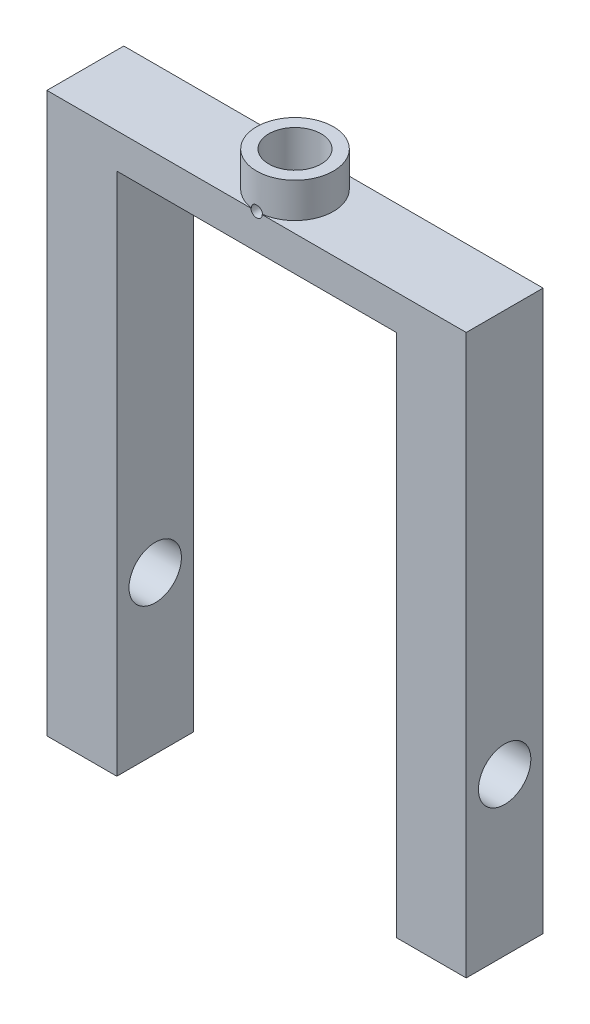
ISO-10303-21;
HEADER;
FILE_DESCRIPTION(('STEP AP214'),'2;1');
FILE_NAME('part.step','',(''),(''),'','','');
FILE_SCHEMA(('AUTOMOTIVE_DESIGN { 1 0 10303 214 1 1 1 1 }'));
ENDSEC;
DATA;
#1=APPLICATION_CONTEXT('core data for automotive mechanical design processes');
#2=APPLICATION_PROTOCOL_DEFINITION('international standard','automotive_design',2000,#1);
#3=PRODUCT_CONTEXT('',#1,'mechanical');
#4=PRODUCT('Part','Part','',(#3));
#5=PRODUCT_RELATED_PRODUCT_CATEGORY('part','',(#4));
#6=PRODUCT_DEFINITION_FORMATION('','',#4);
#7=PRODUCT_DEFINITION_CONTEXT('part definition',#1,'design');
#8=PRODUCT_DEFINITION('design','',#6,#7);
#9=PRODUCT_DEFINITION_SHAPE('','',#8);
#10=(LENGTH_UNIT() NAMED_UNIT(*) SI_UNIT(.MILLI.,.METRE.));
#11=(NAMED_UNIT(*) PLANE_ANGLE_UNIT() SI_UNIT($,.RADIAN.));
#12=(NAMED_UNIT(*) SI_UNIT($,.STERADIAN.) SOLID_ANGLE_UNIT());
#13=UNCERTAINTY_MEASURE_WITH_UNIT(LENGTH_MEASURE(1.E-05),#10,'distance_accuracy_value','');
#14=(GEOMETRIC_REPRESENTATION_CONTEXT(3) GLOBAL_UNCERTAINTY_ASSIGNED_CONTEXT((#13)) GLOBAL_UNIT_ASSIGNED_CONTEXT((#10,
#11,#12)) REPRESENTATION_CONTEXT('',''));
#15=CARTESIAN_POINT('',(0.,0.,0.));
#16=DIRECTION('',(0.,0.,1.));
#17=DIRECTION('',(1.,0.,0.));
#18=AXIS2_PLACEMENT_3D('',#15,#16,#17);
#19=CARTESIAN_POINT('',(0.,-107.95,0.));
#20=DIRECTION('',(0.,-1.,0.));
#21=DIRECTION('',(0.,0.,-1.));
#22=AXIS2_PLACEMENT_3D('',#19,#20,#21);
#23=PLANE('',#22);
#24=DIRECTION('',(0.,0.,-1.));
#25=VECTOR('',#24,1.);
#26=CARTESIAN_POINT('',(25.3999999999999,-107.95,6.98500000000001));
#27=LINE('',#26,#25);
#28=CARTESIAN_POINT('',(25.3999999999999,-107.95,6.98500000000001));
#29=VERTEX_POINT('',#28);
#30=CARTESIAN_POINT('',(25.3999999999999,-107.95,-6.985));
#31=VERTEX_POINT('',#30);
#32=EDGE_CURVE('E213',#29,#31,#27,.T.);
#33=ORIENTED_EDGE('',*,*,#32,.T.);
#34=DIRECTION('',(1.,0.,0.));
#35=VECTOR('',#34,1.);
#36=CARTESIAN_POINT('',(-38.1,-107.95,-6.98500000000001));
#37=LINE('',#36,#35);
#38=CARTESIAN_POINT('',(38.1,-107.95,-6.985));
#39=VERTEX_POINT('',#38);
#40=EDGE_CURVE('E236',#31,#39,#37,.T.);
#41=ORIENTED_EDGE('',*,*,#40,.T.);
#42=DIRECTION('',(0.,0.,1.));
#43=VECTOR('',#42,1.);
#44=CARTESIAN_POINT('',(38.1,-107.95,6.985));
#45=LINE('',#44,#43);
#46=CARTESIAN_POINT('',(38.1,-107.95,6.985));
#47=VERTEX_POINT('',#46);
#48=EDGE_CURVE('E148',#39,#47,#45,.T.);
#49=ORIENTED_EDGE('',*,*,#48,.T.);
#50=DIRECTION('',(-1.,0.,0.));
#51=VECTOR('',#50,1.);
#52=CARTESIAN_POINT('',(-38.1,-107.95,6.98499999999999));
#53=LINE('',#52,#51);
#54=EDGE_CURVE('E231',#47,#29,#53,.T.);
#55=ORIENTED_EDGE('',*,*,#54,.T.);
#56=EDGE_LOOP('',(#33,#41,#49,#55));
#57=FACE_BOUND('',#56,.T.);
#58=ADVANCED_FACE('F36',(#57),#23,.T.);
#59=CARTESIAN_POINT('',(0.,-6.35,0.));
#60=DIRECTION('',(0.,1.,0.));
#61=DIRECTION('',(0.,0.,1.));
#62=AXIS2_PLACEMENT_3D('',#59,#60,#61);
#63=CYLINDRICAL_SURFACE('',#62,6.985);
#64=CARTESIAN_POINT('',(1.016,-6.35,6.9107140730897));
#65=CARTESIAN_POINT('',(1.01599999036809,-6.32157684556948,6.91071305173377));
#66=CARTESIAN_POINT('',(1.01480651768152,-6.29316745737576,6.91088964939588));
#67=CARTESIAN_POINT('',(1.01004645072241,-6.2365549568507,6.911587352141));
#68=CARTESIAN_POINT('',(1.00648006402735,-6.2083518266945,6.91210842708984));
#69=CARTESIAN_POINT('',(0.992261159388178,-6.12442596624138,6.91416953381463));
#70=CARTESIAN_POINT('',(0.978088766424581,-6.06927013667723,6.91620753292066));
#71=CARTESIAN_POINT('',(0.940772924463184,-5.96215390341402,6.92138148427197));
#72=CARTESIAN_POINT('',(0.91762697828166,-5.91019439386286,6.92451774212002));
#73=CARTESIAN_POINT('',(0.863032429489422,-5.81088984181423,6.93153335744361));
#74=CARTESIAN_POINT('',(0.831584129691488,-5.76354463110507,6.93541268781555));
#75=CARTESIAN_POINT('',(0.761029833699582,-5.67447085503985,6.94350948822901));
#76=CARTESIAN_POINT('',(0.721874425912517,-5.63278162940318,6.94772903054114));
#77=CARTESIAN_POINT('',(0.637119146551409,-5.55653624982176,6.95601278484631));
#78=CARTESIAN_POINT('',(0.591518292513914,-5.52198118529912,6.96007697303891));
#79=CARTESIAN_POINT('',(0.494915621597855,-5.46084514450002,6.96761348032175));
#80=CARTESIAN_POINT('',(0.443890471994598,-5.43430067136693,6.97108305976884));
#81=CARTESIAN_POINT('',(0.338050219253178,-5.3901746672424,6.97701604932496));
#82=CARTESIAN_POINT('',(0.283235525603796,-5.37259216955578,6.97947956794836));
#83=CARTESIAN_POINT('',(0.171779319476236,-5.34700745317077,6.98310836075859));
#84=CARTESIAN_POINT('',(0.115153402065585,-5.33893859767276,6.984282661027));
#85=CARTESIAN_POINT('',(0.00133861272186087,-5.33240332110522,6.98523163298345));
#86=CARTESIAN_POINT('',(-0.0558502431551254,-5.33393662695137,6.98500634447563));
#87=CARTESIAN_POINT('',(-0.168710122756923,-5.346509753424,6.98318870008276));
#88=CARTESIAN_POINT('',(-0.224389352177777,-5.35747762542299,6.98160669091551));
#89=CARTESIAN_POINT('',(-0.333108209710927,-5.38849564280041,6.97726491351187));
#90=CARTESIAN_POINT('',(-0.386147788681089,-5.40854595719569,6.97450512335798));
#91=CARTESIAN_POINT('',(-0.48830175390392,-5.45723430676919,6.96810001528113));
#92=CARTESIAN_POINT('',(-0.537401344261476,-5.48590295438363,6.96445154968561));
#93=CARTESIAN_POINT('',(-0.630117999079428,-5.55099074025382,6.95667622736747));
#94=CARTESIAN_POINT('',(-0.673734942726579,-5.58741004925222,6.95254936010685));
#95=CARTESIAN_POINT('',(-0.754668797475733,-5.66736089508009,6.94423310761391));
#96=CARTESIAN_POINT('',(-0.791924587819837,-5.71095429957404,6.9400434955334));
#97=CARTESIAN_POINT('',(-0.858611905213315,-5.80382281637511,6.93210952004255));
#98=CARTESIAN_POINT('',(-0.888041153604406,-5.85309957738924,6.92836528647692));
#99=CARTESIAN_POINT('',(-0.938247106758047,-5.95600469297155,6.92174558665047));
#100=CARTESIAN_POINT('',(-0.959012692680069,-6.00963853460182,6.91887123808019));
#101=CARTESIAN_POINT('',(-0.991194358104133,-6.11964570020347,6.91433491579088));
#102=CARTESIAN_POINT('',(-1.00262446494641,-6.17601477871999,6.91267112352168));
#103=CARTESIAN_POINT('',(-1.01148555308549,-6.25233342050566,6.91137644232012));
#104=CARTESIAN_POINT('',(-1.01317923253166,-6.27184480632509,6.91112825037971));
#105=CARTESIAN_POINT('',(-1.01543495868127,-6.31090133201644,6.91079724744971));
#106=CARTESIAN_POINT('',(-1.01599890674254,-6.33044635967163,6.91071415859065));
#107=CARTESIAN_POINT('',(-1.016,-6.35,6.9107140730897));
#108=B_SPLINE_CURVE_WITH_KNOTS('',3,(#64,#65,#66,#67,#68,#69,#70,#71,#72,#73,#74,#75,#76,#77,
#78,#79,#80,#81,#82,#83,#84,#85,#86,#87,#88,#89,#90,#91,#92,#93,#94,#95,#96,#97,#98,#99,#100,
#101,#102,#103,#104,#105,#106,#107),.UNSPECIFIED.,.F.,.F.,(4,2,2,2,2,2,2,2,2,2,2,2,2,2,2,2,2,2,
2,2,2,4),(0.,0.0852166102056675,0.170425766823022,0.340498682935259,0.510618961391925,
0.680733035887453,0.851975517308368,1.02324412900306,1.19528179575802,1.36730090151628,
1.53810783058628,1.70890990194984,1.8784208576668,2.04793496797439,2.21805845562603,
2.38818569138873,2.5598653662009,2.73159497010127,2.90354429675149,3.07523477731295,
3.13396912460628,3.19260453762909),.UNSPECIFIED.);
#109=CARTESIAN_POINT('',(1.016,-6.35,6.9107140730897));
#110=VERTEX_POINT('',#109);
#111=CARTESIAN_POINT('',(-1.016,-6.35,6.9107140730897));
#112=VERTEX_POINT('',#111);
#113=EDGE_CURVE('E140',#110,#112,#108,.T.);
#114=ORIENTED_EDGE('',*,*,#113,.F.);
#115=CARTESIAN_POINT('',(0.,-6.35,0.));
#116=DIRECTION('',(0.,1.,0.));
#117=DIRECTION('',(0.,0.,1.));
#118=AXIS2_PLACEMENT_3D('',#115,#116,#117);
#119=CIRCLE('',#118,6.985);
#120=CARTESIAN_POINT('',(1.016,-6.35,-6.9107140730897));
#121=VERTEX_POINT('',#120);
#122=EDGE_CURVE('E171',#110,#121,#119,.T.);
#123=ORIENTED_EDGE('',*,*,#122,.T.);
#124=CARTESIAN_POINT('',(-1.016,-6.35,-6.9107140730897));
#125=CARTESIAN_POINT('',(-1.01599999036809,-6.32157684556948,-6.91071305173377));
#126=CARTESIAN_POINT('',(-1.01480651768152,-6.29316745737576,-6.91088964939588));
#127=CARTESIAN_POINT('',(-1.01004645072241,-6.2365549568507,-6.911587352141));
#128=CARTESIAN_POINT('',(-1.00648006402735,-6.2083518266945,-6.91210842708984));
#129=CARTESIAN_POINT('',(-0.992261159388179,-6.12442596624138,-6.91416953381463));
#130=CARTESIAN_POINT('',(-0.978088766424583,-6.06927013667723,-6.91620753292066));
#131=CARTESIAN_POINT('',(-0.940772924463186,-5.96215390341402,-6.92138148427197));
#132=CARTESIAN_POINT('',(-0.917626978281662,-5.91019439386286,-6.92451774212002));
#133=CARTESIAN_POINT('',(-0.863032429489424,-5.81088984181423,-6.93153335744361));
#134=CARTESIAN_POINT('',(-0.83158412969149,-5.76354463110507,-6.93541268781555));
#135=CARTESIAN_POINT('',(-0.761029833699584,-5.67447085503985,-6.94350948822901));
#136=CARTESIAN_POINT('',(-0.721874425912519,-5.63278162940318,-6.94772903054114));
#137=CARTESIAN_POINT('',(-0.637119146551411,-5.55653624982176,-6.95601278484631));
#138=CARTESIAN_POINT('',(-0.591518292513916,-5.52198118529912,-6.96007697303891));
#139=CARTESIAN_POINT('',(-0.494915621597856,-5.46084514450002,-6.96761348032175));
#140=CARTESIAN_POINT('',(-0.443890471994599,-5.43430067136693,-6.97108305976884));
#141=CARTESIAN_POINT('',(-0.33805021925318,-5.3901746672424,-6.97701604932496));
#142=CARTESIAN_POINT('',(-0.283235525603798,-5.37259216955578,-6.97947956794835));
#143=CARTESIAN_POINT('',(-0.171779319476238,-5.34700745317077,-6.98310836075859));
#144=CARTESIAN_POINT('',(-0.115153402065586,-5.33893859767276,-6.984282661027));
#145=CARTESIAN_POINT('',(-0.00133861272186251,-5.33240332110522,-6.98523163298345));
#146=CARTESIAN_POINT('',(0.0558502431551237,-5.33393662695137,-6.98500634447563));
#147=CARTESIAN_POINT('',(0.168710122756922,-5.346509753424,-6.98318870008276));
#148=CARTESIAN_POINT('',(0.224389352177775,-5.35747762542299,-6.98160669091551));
#149=CARTESIAN_POINT('',(0.333108209710926,-5.38849564280041,-6.97726491351187));
#150=CARTESIAN_POINT('',(0.386147788681087,-5.40854595719569,-6.97450512335798));
#151=CARTESIAN_POINT('',(0.488301753903918,-5.45723430676919,-6.96810001528113));
#152=CARTESIAN_POINT('',(0.537401344261475,-5.48590295438363,-6.96445154968561));
#153=CARTESIAN_POINT('',(0.630117999079426,-5.55099074025382,-6.95667622736747));
#154=CARTESIAN_POINT('',(0.673734942726577,-5.58741004925222,-6.95254936010685));
#155=CARTESIAN_POINT('',(0.754668797475731,-5.66736089508009,-6.94423310761391));
#156=CARTESIAN_POINT('',(0.791924587819834,-5.71095429957404,-6.9400434955334));
#157=CARTESIAN_POINT('',(0.858611905213313,-5.80382281637511,-6.93210952004255));
#158=CARTESIAN_POINT('',(0.888041153604403,-5.85309957738924,-6.92836528647692));
#159=CARTESIAN_POINT('',(0.938247106758045,-5.95600469297155,-6.92174558665048));
#160=CARTESIAN_POINT('',(0.959012692680067,-6.00963853460182,-6.9188712380802));
#161=CARTESIAN_POINT('',(0.991194358104131,-6.11964570020347,-6.91433491579088));
#162=CARTESIAN_POINT('',(1.00262446494641,-6.17601477871999,-6.91267112352168));
#163=CARTESIAN_POINT('',(1.01148555308548,-6.25233342050566,-6.91137644232012));
#164=CARTESIAN_POINT('',(1.01317923253166,-6.27184480632509,-6.91112825037971));
#165=CARTESIAN_POINT('',(1.01543495868127,-6.31090133201643,-6.91079724744971));
#166=CARTESIAN_POINT('',(1.01599890674254,-6.33044635967163,-6.91071415859065));
#167=CARTESIAN_POINT('',(1.016,-6.35,-6.9107140730897));
#168=B_SPLINE_CURVE_WITH_KNOTS('',3,(#124,#125,#126,#127,#128,#129,#130,#131,#132,#133,#134,
#135,#136,#137,#138,#139,#140,#141,#142,#143,#144,#145,#146,#147,#148,#149,#150,#151,#152,#153,
#154,#155,#156,#157,#158,#159,#160,#161,#162,#163,#164,#165,#166,#167),.UNSPECIFIED.,.F.,.F.,(4,
2,2,2,2,2,2,2,2,2,2,2,2,2,2,2,2,2,2,2,2,4),(0.,0.0852166102056675,0.170425766823022,
0.340498682935259,0.510618961391925,0.680733035887453,0.851975517308368,1.02324412900306,
1.19528179575802,1.36730090151628,1.53810783058629,1.70890990194984,1.8784208576668,
2.04793496797439,2.21805845562603,2.38818569138873,2.5598653662009,2.73159497010127,
2.90354429675149,3.07523477731295,3.13396912460628,3.19260453762909),.UNSPECIFIED.);
#169=CARTESIAN_POINT('',(-1.016,-6.35,-6.9107140730897));
#170=VERTEX_POINT('',#169);
#171=EDGE_CURVE('E60',#170,#121,#168,.T.);
#172=ORIENTED_EDGE('',*,*,#171,.F.);
#173=EDGE_CURVE('E168',#170,#112,#119,.T.);
#174=ORIENTED_EDGE('',*,*,#173,.T.);
#175=EDGE_LOOP('',(#114,#123,#172,#174));
#176=FACE_BOUND('',#175,.T.);
#177=CARTESIAN_POINT('',(0.,0.,0.));
#178=DIRECTION('',(0.,1.,0.));
#179=DIRECTION('',(0.,0.,1.));
#180=AXIS2_PLACEMENT_3D('',#177,#178,#179);
#181=CIRCLE('',#180,6.985);
#182=CARTESIAN_POINT('',(0.,0.,6.985));
#183=VERTEX_POINT('',#182);
#184=EDGE_CURVE('E167',#183,#183,#181,.T.);
#185=ORIENTED_EDGE('',*,*,#184,.F.);
#186=EDGE_LOOP('',(#185));
#187=FACE_BOUND('',#186,.T.);
#188=ADVANCED_FACE('F38',(#176,#187),#63,.T.);
#189=CARTESIAN_POINT('',(0.,0.,0.));
#190=DIRECTION('',(0.,1.,0.));
#191=DIRECTION('',(0.,0.,1.));
#192=AXIS2_PLACEMENT_3D('',#189,#190,#191);
#193=PLANE('',#192);
#194=CARTESIAN_POINT('',(0.,0.,0.));
#195=DIRECTION('',(0.,1.,0.));
#196=DIRECTION('',(0.,0.,1.));
#197=AXIS2_PLACEMENT_3D('',#194,#195,#196);
#198=CIRCLE('',#197,4.7625);
#199=CARTESIAN_POINT('',(0.,0.,4.7625));
#200=VERTEX_POINT('',#199);
#201=EDGE_CURVE('E164',#200,#200,#198,.T.);
#202=ORIENTED_EDGE('',*,*,#201,.F.);
#203=EDGE_LOOP('',(#202));
#204=FACE_BOUND('',#203,.T.);
#205=ORIENTED_EDGE('',*,*,#184,.T.);
#206=EDGE_LOOP('',(#205));
#207=FACE_BOUND('',#206,.T.);
#208=ADVANCED_FACE('F287',(#204,#207),#193,.T.);
#209=CARTESIAN_POINT('',(0.,-63.5,0.));
#210=DIRECTION('',(0.,1.,0.));
#211=DIRECTION('',(0.,0.,1.));
#212=AXIS2_PLACEMENT_3D('',#209,#210,#211);
#213=CYLINDRICAL_SURFACE('',#212,4.7625);
#214=CARTESIAN_POINT('',(0.,-7.366,4.7625));
#215=CARTESIAN_POINT('',(0.0563844626269982,-7.36599802781405,4.76249895673298));
#216=CARTESIAN_POINT('',(0.112793074959932,-7.36129043710548,4.76148846913532));
#217=CARTESIAN_POINT('',(0.224010350170093,-7.34260263850676,4.75755499453595));
#218=CARTESIAN_POINT('',(0.278817800645457,-7.32861558494378,4.75463059561945));
#219=CARTESIAN_POINT('',(0.385209148414719,-7.2918250455093,4.74719518742165));
#220=CARTESIAN_POINT('',(0.436796268547741,-7.26903054374789,4.74268579534767));
#221=CARTESIAN_POINT('',(0.53541152615669,-7.21530014417231,4.73256813284778));
#222=CARTESIAN_POINT('',(0.582439826614029,-7.18436453755606,4.72695990172791));
#223=CARTESIAN_POINT('',(0.671324662992692,-7.11472870265446,4.71516380296902));
#224=CARTESIAN_POINT('',(0.713101409348593,-7.07592778797956,4.70896903969119));
#225=CARTESIAN_POINT('',(0.789605682168651,-6.99187899558539,4.69674711588073));
#226=CARTESIAN_POINT('',(0.824332604114973,-6.9466305655616,4.69071996975937));
#227=CARTESIAN_POINT('',(0.886099813821638,-6.85038597213697,4.67944791154241));
#228=CARTESIAN_POINT('',(0.913055847892545,-6.79933460849405,4.67421184666522));
#229=CARTESIAN_POINT('',(0.957975859641681,-6.69329667376942,4.66521347578965));
#230=CARTESIAN_POINT('',(0.975940856432099,-6.63831054949117,4.66145100277374));
#231=CARTESIAN_POINT('',(1.00210651455278,-6.52682742186495,4.65589591491856));
#232=CARTESIAN_POINT('',(1.01044807248282,-6.47036493236595,4.65407490599859));
#233=CARTESIAN_POINT('',(1.01756803147105,-6.35681479196431,4.65252359691289));
#234=CARTESIAN_POINT('',(1.01634754887166,-6.29972721481605,4.65279305269102));
#235=CARTESIAN_POINT('',(1.00449161438515,-6.18758988824679,4.65536649423503));
#236=CARTESIAN_POINT('',(0.994019193338167,-6.13252197158869,4.65763524810735));
#237=CARTESIAN_POINT('',(0.964214663101185,-6.02494308617156,4.66389601929689));
#238=CARTESIAN_POINT('',(0.944882078639876,-5.97243225474526,4.6678881290566));
#239=CARTESIAN_POINT('',(0.897754543284646,-5.87099640286548,4.67718090584144));
#240=CARTESIAN_POINT('',(0.869896333842202,-5.82210170045746,4.68249129666887));
#241=CARTESIAN_POINT('',(0.80655286502954,-5.72962042209973,4.69381624331275));
#242=CARTESIAN_POINT('',(0.771066614099409,-5.68603453739187,4.69983089062834));
#243=CARTESIAN_POINT('',(0.692608449372285,-5.60446888126178,4.71203825492389));
#244=CARTESIAN_POINT('',(0.649497749592721,-5.56662265015647,4.71823209190476));
#245=CARTESIAN_POINT('',(0.557472061775643,-5.49867619230847,4.72998725753749));
#246=CARTESIAN_POINT('',(0.508556978312315,-5.46857609294029,4.7355485757876));
#247=CARTESIAN_POINT('',(0.40615240196031,-5.41694581137028,4.74542878662929));
#248=CARTESIAN_POINT('',(0.352654170437356,-5.39543246395094,4.74974523403599));
#249=CARTESIAN_POINT('',(0.242689727547825,-5.36173721833529,4.75663108108472));
#250=CARTESIAN_POINT('',(0.186223927456012,-5.34955403069916,4.75920072213205));
#251=CARTESIAN_POINT('',(0.0730732895603511,-5.33505763683325,4.76226928636029));
#252=CARTESIAN_POINT('',(0.0164128428785966,-5.3325619156994,4.76280649620917));
#253=CARTESIAN_POINT('',(-0.0965153559452815,-5.33701753981994,4.76185667827924));
#254=CARTESIAN_POINT('',(-0.152783133125559,-5.34396827709519,4.76036978077304));
#255=CARTESIAN_POINT('',(-0.262728749611462,-5.36696807301237,4.75556291925799));
#256=CARTESIAN_POINT('',(-0.316427398217918,-5.38292201831348,4.75226212732976));
#257=CARTESIAN_POINT('',(-0.420386761328547,-5.4233702707639,4.74419668083851));
#258=CARTESIAN_POINT('',(-0.470647192553415,-5.44786528061157,4.73943190583314));
#259=CARTESIAN_POINT('',(-0.567062588740859,-5.50508492238259,4.72887226744177));
#260=CARTESIAN_POINT('',(-0.613151973933937,-5.53791756683692,4.72306420231049));
#261=CARTESIAN_POINT('',(-0.699232510619355,-5.61073754407921,4.71109034202162));
#262=CARTESIAN_POINT('',(-0.739222910204588,-5.6507257577155,4.70492450288537));
#263=CARTESIAN_POINT('',(-0.812686827514903,-5.73755738416359,4.69279871582542));
#264=CARTESIAN_POINT('',(-0.846034271432798,-5.78450836581414,4.6868442476404));
#265=CARTESIAN_POINT('',(-0.904370869089752,-5.8834519818099,4.67593882398893));
#266=CARTESIAN_POINT('',(-0.929360377887901,-5.93544440186529,4.67098782589691));
#267=CARTESIAN_POINT('',(-0.970107325899271,-6.04272005516094,4.66269566041667));
#268=CARTESIAN_POINT('',(-0.985915651792797,-6.09798324201427,4.65934563831651));
#269=CARTESIAN_POINT('',(-1.00800226948227,-6.21046175093359,4.65461787533928));
#270=CARTESIAN_POINT('',(-1.0142820003555,-6.2676767768839,4.65323983664081));
#271=CARTESIAN_POINT('',(-1.01707426037763,-6.38116532837086,4.65263018010158));
#272=CARTESIAN_POINT('',(-1.01378647180097,-6.43743379805319,4.65335467962954));
#273=CARTESIAN_POINT('',(-0.997981735336247,-6.5485953626206,4.65676957783197));
#274=CARTESIAN_POINT('',(-0.985464885429202,-6.60348847210089,4.65945995563555));
#275=CARTESIAN_POINT('',(-0.951651657537014,-6.71019184033586,4.6664825982999));
#276=CARTESIAN_POINT('',(-0.930382987590452,-6.76201124324431,4.6708096779428));
#277=CARTESIAN_POINT('',(-0.879694180993217,-6.86137634814395,4.68062046117072));
#278=CARTESIAN_POINT('',(-0.850273243242921,-6.90892162952122,4.68610427841231));
#279=CARTESIAN_POINT('',(-0.783446902673266,-6.99937619518043,4.69774268223457));
#280=CARTESIAN_POINT('',(-0.745898620808694,-7.0421785421409,4.70390815442029));
#281=CARTESIAN_POINT('',(-0.664174661027307,-7.12094050291085,4.71614058952408));
#282=CARTESIAN_POINT('',(-0.619997456785978,-7.15689853646467,4.72220752939737));
#283=CARTESIAN_POINT('',(-0.525620103169967,-7.22136988505508,4.73364704227093));
#284=CARTESIAN_POINT('',(-0.475353001223227,-7.24978694178084,4.73901023281778));
#285=CARTESIAN_POINT('',(-0.370653335418521,-7.29772416408342,4.74834441943046));
#286=CARTESIAN_POINT('',(-0.316224390091353,-7.31725195800496,4.75231660850988));
#287=CARTESIAN_POINT('',(-0.218100124570982,-7.34328589945028,4.75769368190114));
#288=CARTESIAN_POINT('',(-0.174944300637535,-7.35178775680359,4.75948507228609));
#289=CARTESIAN_POINT('',(-0.0878638522627293,-7.36314546163905,4.7618886140483));
#290=CARTESIAN_POINT('',(-0.0439392589073079,-7.36600153688419,4.76250081299666));
#291=CARTESIAN_POINT('',(0.,-7.366,4.7625));
#292=B_SPLINE_CURVE_WITH_KNOTS('',3,(#214,#215,#216,#217,#218,#219,#220,#221,#222,#223,#224,
#225,#226,#227,#228,#229,#230,#231,#232,#233,#234,#235,#236,#237,#238,#239,#240,#241,#242,#243,
#244,#245,#246,#247,#248,#249,#250,#251,#252,#253,#254,#255,#256,#257,#258,#259,#260,#261,#262,
#263,#264,#265,#266,#267,#268,#269,#270,#271,#272,#273,#274,#275,#276,#277,#278,#279,#280,#281,
#282,#283,#284,#285,#286,#287,#288,#289,#290,#291),.UNSPECIFIED.,.T.,.F.,(4,2,2,2,2,2,2,2,2,2,2,
2,2,2,2,2,2,2,2,2,2,2,2,2,2,2,2,2,2,2,2,2,2,2,2,2,2,2,4),(0.,0.168992580387775,
0.338109969319218,0.50705530216121,0.675994592844599,0.847251218816112,1.0185225237342,
1.19158638441572,1.36463062428471,1.53510782090322,1.70556511506571,1.87307734451114,
2.04059856059405,2.20939419332268,2.37821178087482,2.55049693260358,2.72278491714456,
2.89540904151401,3.06800930470525,3.2373414755477,3.40666274859645,3.57422786165849,
3.74180676404641,3.91167848623336,4.08157113397952,4.25443220932223,4.42728594030375,
4.59917225493719,4.77103260747243,4.93933197990242,5.10762956559519,5.27539837560668,
5.44318367762093,5.61420081535429,5.78525739076936,5.95840251613624,6.1313987751364,
6.26309655094658,6.39478901367686),.UNSPECIFIED.);
#293=CARTESIAN_POINT('',(0.,-7.366,4.7625));
#294=VERTEX_POINT('',#293);
#295=EDGE_CURVE('E187',#294,#294,#292,.T.);
#296=ORIENTED_EDGE('',*,*,#295,.T.);
#297=EDGE_LOOP('',(#296));
#298=FACE_BOUND('',#297,.T.);
#299=CARTESIAN_POINT('',(1.016,-6.35,-4.65286473583748));
#300=CARTESIAN_POINT('',(1.01599801576459,-6.40636800388528,-4.65286587355159));
#301=CARTESIAN_POINT('',(1.01129307972245,-6.46276018802121,-4.65390020873217));
#302=CARTESIAN_POINT('',(0.992616780304668,-6.5739433591813,-4.65791864150835));
#303=CARTESIAN_POINT('',(0.978638505946927,-6.62873312017533,-4.66090419322901));
#304=CARTESIAN_POINT('',(0.941873629948344,-6.73508699124913,-4.66847189208986));
#305=CARTESIAN_POINT('',(0.919096424076567,-6.78665447416762,-4.67305233564265));
#306=CARTESIAN_POINT('',(0.865406803845662,-6.8852365842744,-4.68329167418235));
#307=CARTESIAN_POINT('',(0.83449464141561,-6.93225135239269,-4.68895053577054));
#308=CARTESIAN_POINT('',(0.764882917069571,-7.02115044786888,-4.70081072765601));
#309=CARTESIAN_POINT('',(0.726077399805326,-7.06295093463981,-4.70701870855264));
#310=CARTESIAN_POINT('',(0.642009303727054,-7.13950131806705,-4.71921934129388));
#311=CARTESIAN_POINT('',(0.596746238450536,-7.17425068306739,-4.72521197687341));
#312=CARTESIAN_POINT('',(0.500487812751033,-7.23604219991926,-4.73637893556834));
#313=CARTESIAN_POINT('',(0.449439766159013,-7.26300399694379,-4.74154449775951));
#314=CARTESIAN_POINT('',(0.343408992865176,-7.30793556528545,-4.75040028963118));
#315=CARTESIAN_POINT('',(0.288426686558098,-7.3259062957065,-4.75409067666458));
#316=CARTESIAN_POINT('',(0.176959423376635,-7.3520827111015,-4.75953331786731));
#317=CARTESIAN_POINT('',(0.120509163264129,-7.36043020111512,-4.76131368945404));
#318=CARTESIAN_POINT('',(0.00698327740264601,-7.36756626774982,-4.76283302707285));
#319=CARTESIAN_POINT('',(-0.0500922794704674,-7.36635588679763,-4.76257221572606));
#320=CARTESIAN_POINT('',(-0.162271965507565,-7.35451675926192,-4.7600601512617));
#321=CARTESIAN_POINT('',(-0.21739305188001,-7.34404082987405,-4.75784119526682));
#322=CARTESIAN_POINT('',(-0.325076427690872,-7.31421116202494,-4.75169884956543));
#323=CARTESIAN_POINT('',(-0.37763860509791,-7.29485703525402,-4.74777538530848));
#324=CARTESIAN_POINT('',(-0.479139810629405,-7.24768330478238,-4.7386125422121));
#325=CARTESIAN_POINT('',(-0.528050799680563,-7.21980520038412,-4.7333641148739));
#326=CARTESIAN_POINT('',(-0.620556385989135,-7.15641839247413,-4.72212775676388));
#327=CARTESIAN_POINT('',(-0.664150290930595,-7.12090869694292,-4.71613972989566));
#328=CARTESIAN_POINT('',(-0.745692556840185,-7.0424328078781,-4.70394354557891));
#329=CARTESIAN_POINT('',(-0.783512004187263,-6.99933286301451,-4.69773337718631));
#330=CARTESIAN_POINT('',(-0.851409398130921,-6.90733859527155,-4.68590435079411));
#331=CARTESIAN_POINT('',(-0.881487155009428,-6.85844413043438,-4.68028550728752));
#332=CARTESIAN_POINT('',(-0.933100814054983,-6.75604727086455,-4.67027038667192));
#333=CARTESIAN_POINT('',(-0.95461339460441,-6.70253277152883,-4.66587745711669));
#334=CARTESIAN_POINT('',(-0.988302228565442,-6.59253267158315,-4.65885867259004));
#335=CARTESIAN_POINT('',(-1.00047988358828,-6.53604751836952,-4.65623255234473));
#336=CARTESIAN_POINT('',(-1.01495540045912,-6.42288462690075,-4.65309855219236));
#337=CARTESIAN_POINT('',(-1.01744051117202,-6.36623192514545,-4.65255053162509));
#338=CARTESIAN_POINT('',(-1.01296643735987,-6.25332167404468,-4.65352665668286));
#339=CARTESIAN_POINT('',(-1.00600786765198,-6.19706409921473,-4.65505066741132));
#340=CARTESIAN_POINT('',(-0.983006122743022,-6.08718630643802,-4.65996132495301));
#341=CARTESIAN_POINT('',(-0.967065162986005,-6.03354366751809,-4.66332700220772));
#342=CARTESIAN_POINT('',(-0.926661406207641,-5.92969064295339,-4.6715230064747));
#343=CARTESIAN_POINT('',(-0.902197826525817,-5.87948057303956,-4.6763534679977));
#344=CARTESIAN_POINT('',(-0.845027372661013,-5.78310496089212,-4.68702355052558));
#345=CARTESIAN_POINT('',(-0.812204610327412,-5.73700972168332,-4.69287696213641));
#346=CARTESIAN_POINT('',(-0.739399983920291,-5.65091284795116,-4.70489661374079));
#347=CARTESIAN_POINT('',(-0.699417276194534,-5.61091193254755,-4.71106289053763));
#348=CARTESIAN_POINT('',(-0.612582372440938,-5.53741739025315,-4.72314520438194));
#349=CARTESIAN_POINT('',(-0.565621360424497,-5.50405111451318,-4.72905490161764));
#350=CARTESIAN_POINT('',(-0.466651893822959,-5.4456814977383,-4.7398434994514));
#351=CARTESIAN_POINT('',(-0.414643668672484,-5.42067777679055,-4.74472244687296));
#352=CARTESIAN_POINT('',(-0.307371690627028,-5.37992285610098,-4.75287298394571));
#353=CARTESIAN_POINT('',(-0.252130347809045,-5.36411473281318,-4.75615444145243));
#354=CARTESIAN_POINT('',(-0.139698545848657,-5.34202114985736,-4.76078283475008));
#355=CARTESIAN_POINT('',(-0.0825083566509156,-5.33573437677664,-4.76213003735845));
#356=CARTESIAN_POINT('',(0.0309865827629287,-5.33291858976441,-4.76273068322822));
#357=CARTESIAN_POINT('',(0.0872864749104617,-5.3361990513461,-4.76202500874447));
#358=CARTESIAN_POINT('',(0.198512857553866,-5.35200007839691,-4.75868629565213));
#359=CARTESIAN_POINT('',(0.253439370421762,-5.36452049324787,-4.75605328846052));
#360=CARTESIAN_POINT('',(0.360220928577693,-5.39835662455508,-4.74915823186809));
#361=CARTESIAN_POINT('',(0.412084479675824,-5.41964653440411,-4.74490096497895));
#362=CARTESIAN_POINT('',(0.511529232397216,-5.47039166737612,-4.73521310143927));
#363=CARTESIAN_POINT('',(0.559110039980568,-5.49984764081421,-4.72978239698093));
#364=CARTESIAN_POINT('',(0.64957185032592,-5.56671637618174,-4.71821812480735));
#365=CARTESIAN_POINT('',(0.692351902892584,-5.6042638230861,-4.71207359112307));
#366=CARTESIAN_POINT('',(0.771069274587618,-5.68597646069449,-4.69983500698915));
#367=CARTESIAN_POINT('',(0.807004951719804,-5.7301432348749,-4.69374096898822));
#368=CARTESIAN_POINT('',(0.871447372813972,-5.82450864653248,-4.68220821171785));
#369=CARTESIAN_POINT('',(0.899854967305772,-5.87477617897798,-4.67677870140351));
#370=CARTESIAN_POINT('',(0.947774386136033,-5.97947576138743,-4.6673044952787));
#371=CARTESIAN_POINT('',(0.967293901331951,-6.03390416313176,-4.6632586029809));
#372=CARTESIAN_POINT('',(0.993308451476765,-6.13200744104041,-4.65777558865696));
#373=CARTESIAN_POINT('',(1.0018017938676,-6.17514162291809,-4.65594599724294));
#374=CARTESIAN_POINT('',(1.01314821661666,-6.26217899976878,-4.65349015418274));
#375=CARTESIAN_POINT('',(1.01600154597157,-6.30608216070638,-4.6528638494136));
#376=CARTESIAN_POINT('',(1.016,-6.35,-4.65286473583748));
#377=B_SPLINE_CURVE_WITH_KNOTS('',3,(#299,#300,#301,#302,#303,#304,#305,#306,#307,#308,#309,
#310,#311,#312,#313,#314,#315,#316,#317,#318,#319,#320,#321,#322,#323,#324,#325,#326,#327,#328,
#329,#330,#331,#332,#333,#334,#335,#336,#337,#338,#339,#340,#341,#342,#343,#344,#345,#346,#347,
#348,#349,#350,#351,#352,#353,#354,#355,#356,#357,#358,#359,#360,#361,#362,#363,#364,#365,#366,
#367,#368,#369,#370,#371,#372,#373,#374,#375,#376),.UNSPECIFIED.,.T.,.F.,(4,2,2,2,2,2,2,2,2,2,2,
2,2,2,2,2,2,2,2,2,2,2,2,2,2,2,2,2,2,2,2,2,2,2,2,2,2,2,4),(0.,0.168943102373727,
0.338012251731803,0.506901360695408,0.675785239997251,0.847106600001079,1.01844087287296,
1.19148456800221,1.36450980010617,1.53495141535316,1.70537444168626,1.8730380201716,
2.04070893253287,2.2095574437046,2.37842791653915,2.55064297068741,2.72286224474066,
2.89554728924748,3.0682064005284,3.23751291387655,3.40680840529761,3.57421520787043,
3.74163738801987,3.91152063096912,4.08142390434978,4.25432674977969,4.42722173912492,
4.59903474238004,4.77082404291084,4.93921579006353,5.10760479236505,5.27550176512364,
5.44341416972544,5.61437351952117,5.78537383170837,5.9585254599757,6.13152697403303,
6.26316093467031,6.39478908376915),.UNSPECIFIED.);
#378=CARTESIAN_POINT('',(1.016,-6.35,-4.65286473583748));
#379=VERTEX_POINT('',#378);
#380=EDGE_CURVE('E192',#379,#379,#377,.T.);
#381=ORIENTED_EDGE('',*,*,#380,.T.);
#382=EDGE_LOOP('',(#381));
#383=FACE_BOUND('',#382,.T.);
#384=ORIENTED_EDGE('',*,*,#201,.T.);
#385=EDGE_LOOP('',(#384));
#386=FACE_BOUND('',#385,.T.);
#387=CARTESIAN_POINT('',(0.,-12.7,0.));
#388=DIRECTION('',(0.,1.,0.));
#389=DIRECTION('',(-1.,0.,0.));
#390=AXIS2_PLACEMENT_3D('',#387,#388,#389);
#391=CIRCLE('',#390,4.7625);
#392=CARTESIAN_POINT('',(-4.7625,-12.7,0.));
#393=VERTEX_POINT('',#392);
#394=EDGE_CURVE('E174',#393,#393,#391,.T.);
#395=ORIENTED_EDGE('',*,*,#394,.F.);
#396=EDGE_LOOP('',(#395));
#397=FACE_BOUND('',#396,.T.);
#398=ADVANCED_FACE('F283',(#298,#383,#386,#397),#213,.F.);
#399=CARTESIAN_POINT('',(0.,-6.35,0.));
#400=DIRECTION('',(0.,-1.,0.));
#401=DIRECTION('',(0.,0.,-1.));
#402=AXIS2_PLACEMENT_3D('',#399,#400,#401);
#403=PLANE('',#402);
#404=DIRECTION('',(-1.,0.,0.));
#405=VECTOR('',#404,1.);
#406=CARTESIAN_POINT('',(-38.1,-6.35,6.98499999999999));
#407=LINE('',#406,#405);
#408=CARTESIAN_POINT('',(-1.016,-6.35,6.985));
#409=VERTEX_POINT('',#408);
#410=CARTESIAN_POINT('',(-38.1,-6.35,6.98499999999999));
#411=VERTEX_POINT('',#410);
#412=EDGE_CURVE('E239',#409,#411,#407,.T.);
#413=ORIENTED_EDGE('',*,*,#412,.F.);
#414=DIRECTION('',(0.,0.,1.));
#415=VECTOR('',#414,1.);
#416=CARTESIAN_POINT('',(-1.016,-6.35,-9.85868195874213));
#417=LINE('',#416,#415);
#418=EDGE_CURVE('E257',#409,#112,#417,.F.);
#419=ORIENTED_EDGE('',*,*,#418,.T.);
#420=ORIENTED_EDGE('',*,*,#173,.F.);
#421=CARTESIAN_POINT('',(-1.016,-6.35,-6.985));
#422=VERTEX_POINT('',#421);
#423=EDGE_CURVE('E255',#170,#422,#417,.F.);
#424=ORIENTED_EDGE('',*,*,#423,.T.);
#425=DIRECTION('',(1.,0.,0.));
#426=VECTOR('',#425,1.);
#427=CARTESIAN_POINT('',(-38.1,-6.35,-6.98500000000001));
#428=LINE('',#427,#426);
#429=CARTESIAN_POINT('',(-38.1,-6.35,-6.98500000000001));
#430=VERTEX_POINT('',#429);
#431=EDGE_CURVE('E139',#430,#422,#428,.T.);
#432=ORIENTED_EDGE('',*,*,#431,.F.);
#433=DIRECTION('',(0.,0.,-1.));
#434=VECTOR('',#433,1.);
#435=CARTESIAN_POINT('',(-38.1,-6.35,6.98499999999999));
#436=LINE('',#435,#434);
#437=EDGE_CURVE('E146',#411,#430,#436,.T.);
#438=ORIENTED_EDGE('',*,*,#437,.F.);
#439=EDGE_LOOP('',(#413,#419,#420,#424,#432,#438));
#440=FACE_BOUND('',#439,.T.);
#441=ADVANCED_FACE('F253',(#440),#403,.F.);
#442=DIRECTION('',(0.,0.,-1.));
#443=VECTOR('',#442,1.);
#444=CARTESIAN_POINT('',(-25.4000000000001,-107.95,6.98500000000001));
#445=LINE('',#444,#443);
#446=CARTESIAN_POINT('',(-25.4000000000001,-107.95,6.98500000000001));
#447=VERTEX_POINT('',#446);
#448=CARTESIAN_POINT('',(-25.4000000000001,-107.95,-6.985));
#449=VERTEX_POINT('',#448);
#450=EDGE_CURVE('E224',#447,#449,#445,.T.);
#451=ORIENTED_EDGE('',*,*,#450,.F.);
#452=CARTESIAN_POINT('',(-38.1,-107.95,6.98499999999999));
#453=VERTEX_POINT('',#452);
#454=EDGE_CURVE('E230',#447,#453,#53,.T.);
#455=ORIENTED_EDGE('',*,*,#454,.T.);
#456=DIRECTION('',(0.,0.,-1.));
#457=VECTOR('',#456,1.);
#458=CARTESIAN_POINT('',(-38.1,-107.95,6.98499999999999));
#459=LINE('',#458,#457);
#460=CARTESIAN_POINT('',(-38.1,-107.95,-6.98500000000001));
#461=VERTEX_POINT('',#460);
#462=EDGE_CURVE('E234',#453,#461,#459,.T.);
#463=ORIENTED_EDGE('',*,*,#462,.T.);
#464=EDGE_CURVE('E156',#461,#449,#37,.T.);
#465=ORIENTED_EDGE('',*,*,#464,.T.);
#466=EDGE_LOOP('',(#451,#455,#463,#465));
#467=FACE_BOUND('',#466,.T.);
#468=ADVANCED_FACE('F303',(#467),#23,.T.);
#469=CARTESIAN_POINT('',(-38.1,-107.95,-6.98500000000001));
#470=DIRECTION('',(0.,0.,1.));
#471=DIRECTION('',(1.,0.,0.));
#472=AXIS2_PLACEMENT_3D('',#469,#470,#471);
#473=PLANE('',#472);
#474=ORIENTED_EDGE('',*,*,#431,.T.);
#475=CARTESIAN_POINT('',(0.,-6.35,-6.985));
#476=DIRECTION('',(0.,0.,1.));
#477=DIRECTION('',(1.,0.,0.));
#478=AXIS2_PLACEMENT_3D('',#475,#476,#477);
#479=CIRCLE('',#478,1.016);
#480=CARTESIAN_POINT('',(1.016,-6.35,-6.985));
#481=VERTEX_POINT('',#480);
#482=EDGE_CURVE('E125',#481,#422,#479,.F.);
#483=ORIENTED_EDGE('',*,*,#482,.F.);
#484=CARTESIAN_POINT('',(38.1,-6.35,-6.985));
#485=VERTEX_POINT('',#484);
#486=EDGE_CURVE('E135',#481,#485,#428,.T.);
#487=ORIENTED_EDGE('',*,*,#486,.T.);
#488=DIRECTION('',(0.,1.,0.));
#489=VECTOR('',#488,1.);
#490=CARTESIAN_POINT('',(38.1,-107.95,-6.985));
#491=LINE('',#490,#489);
#492=EDGE_CURVE('E153',#39,#485,#491,.T.);
#493=ORIENTED_EDGE('',*,*,#492,.F.);
#494=ORIENTED_EDGE('',*,*,#40,.F.);
#495=DIRECTION('',(0.,-1.,0.));
#496=VECTOR('',#495,1.);
#497=CARTESIAN_POINT('',(25.3999999999999,-12.7,-6.985));
#498=LINE('',#497,#496);
#499=CARTESIAN_POINT('',(25.3999999999999,-12.7,-6.985));
#500=VERTEX_POINT('',#499);
#501=EDGE_CURVE('E176',#500,#31,#498,.T.);
#502=ORIENTED_EDGE('',*,*,#501,.F.);
#503=DIRECTION('',(1.,0.,0.));
#504=VECTOR('',#503,1.);
#505=CARTESIAN_POINT('',(-25.4000000000001,-12.7,-6.985));
#506=LINE('',#505,#504);
#507=CARTESIAN_POINT('',(-25.4000000000001,-12.7,-6.985));
#508=VERTEX_POINT('',#507);
#509=EDGE_CURVE('E207',#508,#500,#506,.T.);
#510=ORIENTED_EDGE('',*,*,#509,.F.);
#511=DIRECTION('',(0.,1.,0.));
#512=VECTOR('',#511,1.);
#513=CARTESIAN_POINT('',(-25.4000000000001,-12.7,-6.985));
#514=LINE('',#513,#512);
#515=EDGE_CURVE('E215',#449,#508,#514,.T.);
#516=ORIENTED_EDGE('',*,*,#515,.F.);
#517=ORIENTED_EDGE('',*,*,#464,.F.);
#518=DIRECTION('',(0.,1.,0.));
#519=VECTOR('',#518,1.);
#520=CARTESIAN_POINT('',(-38.1,-107.95,-6.98500000000001));
#521=LINE('',#520,#519);
#522=EDGE_CURVE('E155',#461,#430,#521,.T.);
#523=ORIENTED_EDGE('',*,*,#522,.T.);
#524=EDGE_LOOP('',(#474,#483,#487,#493,#494,#502,#510,#516,#517,#523));
#525=FACE_BOUND('',#524,.T.);
#526=ADVANCED_FACE('F133',(#525),#473,.F.);
#527=CARTESIAN_POINT('',(-38.1,-107.95,6.98499999999999));
#528=DIRECTION('',(1.,0.,0.));
#529=DIRECTION('',(0.,0.,-1.));
#530=AXIS2_PLACEMENT_3D('',#527,#528,#529);
#531=PLANE('',#530);
#532=CARTESIAN_POINT('',(-38.1,-79.375,0.));
#533=DIRECTION('',(-1.,0.,0.));
#534=DIRECTION('',(0.,0.,1.));
#535=AXIS2_PLACEMENT_3D('',#532,#533,#534);
#536=CIRCLE('',#535,4.76249999999999);
#537=CARTESIAN_POINT('',(-38.1,-79.375,4.76249999999999));
#538=VERTEX_POINT('',#537);
#539=EDGE_CURVE('E181',#538,#538,#536,.T.);
#540=ORIENTED_EDGE('',*,*,#539,.F.);
#541=EDGE_LOOP('',(#540));
#542=FACE_BOUND('',#541,.T.);
#543=ORIENTED_EDGE('',*,*,#437,.T.);
#544=ORIENTED_EDGE('',*,*,#522,.F.);
#545=ORIENTED_EDGE('',*,*,#462,.F.);
#546=DIRECTION('',(0.,1.,0.));
#547=VECTOR('',#546,1.);
#548=CARTESIAN_POINT('',(-38.1,-107.95,6.98499999999999));
#549=LINE('',#548,#547);
#550=EDGE_CURVE('E158',#453,#411,#549,.T.);
#551=ORIENTED_EDGE('',*,*,#550,.T.);
#552=EDGE_LOOP('',(#543,#544,#545,#551));
#553=FACE_BOUND('',#552,.T.);
#554=ADVANCED_FACE('F251',(#542,#553),#531,.F.);
#555=CARTESIAN_POINT('',(-38.1,-107.95,6.98499999999999));
#556=DIRECTION('',(0.,0.,-1.));
#557=DIRECTION('',(-1.,0.,0.));
#558=AXIS2_PLACEMENT_3D('',#555,#556,#557);
#559=PLANE('',#558);
#560=CARTESIAN_POINT('',(38.1,-6.35,6.985));
#561=VERTEX_POINT('',#560);
#562=CARTESIAN_POINT('',(1.01599999999998,-6.35,6.985));
#563=VERTEX_POINT('',#562);
#564=EDGE_CURVE('E149',#561,#563,#407,.T.);
#565=ORIENTED_EDGE('',*,*,#564,.T.);
#566=CARTESIAN_POINT('',(0.,-6.35,6.985));
#567=DIRECTION('',(0.,0.,1.));
#568=DIRECTION('',(1.,0.,0.));
#569=AXIS2_PLACEMENT_3D('',#566,#567,#568);
#570=CIRCLE('',#569,1.016);
#571=EDGE_CURVE('E52',#409,#563,#570,.T.);
#572=ORIENTED_EDGE('',*,*,#571,.F.);
#573=ORIENTED_EDGE('',*,*,#412,.T.);
#574=ORIENTED_EDGE('',*,*,#550,.F.);
#575=ORIENTED_EDGE('',*,*,#454,.F.);
#576=DIRECTION('',(0.,1.,0.));
#577=VECTOR('',#576,1.);
#578=CARTESIAN_POINT('',(-25.4000000000001,-12.7,6.98500000000001));
#579=LINE('',#578,#577);
#580=CARTESIAN_POINT('',(-25.4000000000001,-12.7,6.985));
#581=VERTEX_POINT('',#580);
#582=EDGE_CURVE('E206',#447,#581,#579,.T.);
#583=ORIENTED_EDGE('',*,*,#582,.T.);
#584=DIRECTION('',(1.,0.,0.));
#585=VECTOR('',#584,1.);
#586=CARTESIAN_POINT('',(-25.4000000000001,-12.7,6.98500000000001));
#587=LINE('',#586,#585);
#588=CARTESIAN_POINT('',(25.3999999999999,-12.7,6.98500000000001));
#589=VERTEX_POINT('',#588);
#590=EDGE_CURVE('E210',#581,#589,#587,.T.);
#591=ORIENTED_EDGE('',*,*,#590,.T.);
#592=DIRECTION('',(0.,-1.,0.));
#593=VECTOR('',#592,1.);
#594=CARTESIAN_POINT('',(25.3999999999999,-12.7,6.98500000000001));
#595=LINE('',#594,#593);
#596=EDGE_CURVE('E203',#589,#29,#595,.T.);
#597=ORIENTED_EDGE('',*,*,#596,.T.);
#598=ORIENTED_EDGE('',*,*,#54,.F.);
#599=DIRECTION('',(0.,1.,0.));
#600=VECTOR('',#599,1.);
#601=CARTESIAN_POINT('',(38.1,-107.95,6.985));
#602=LINE('',#601,#600);
#603=EDGE_CURVE('E161',#47,#561,#602,.T.);
#604=ORIENTED_EDGE('',*,*,#603,.T.);
#605=EDGE_LOOP('',(#565,#572,#573,#574,#575,#583,#591,#597,#598,#604));
#606=FACE_BOUND('',#605,.T.);
#607=ADVANCED_FACE('F244',(#606),#559,.F.);
#608=CARTESIAN_POINT('',(38.1,-107.95,6.985));
#609=DIRECTION('',(-1.,0.,0.));
#610=DIRECTION('',(0.,0.,1.));
#611=AXIS2_PLACEMENT_3D('',#608,#609,#610);
#612=PLANE('',#611);
#613=CARTESIAN_POINT('',(38.1,-79.375,0.));
#614=DIRECTION('',(-1.,0.,0.));
#615=DIRECTION('',(0.,0.,1.));
#616=AXIS2_PLACEMENT_3D('',#613,#614,#615);
#617=CIRCLE('',#616,4.76249999999999);
#618=CARTESIAN_POINT('',(38.1,-79.375,4.7625));
#619=VERTEX_POINT('',#618);
#620=EDGE_CURVE('E177',#619,#619,#617,.F.);
#621=ORIENTED_EDGE('',*,*,#620,.F.);
#622=EDGE_LOOP('',(#621));
#623=FACE_BOUND('',#622,.T.);
#624=DIRECTION('',(0.,0.,1.));
#625=VECTOR('',#624,1.);
#626=CARTESIAN_POINT('',(38.1,-6.35,6.985));
#627=LINE('',#626,#625);
#628=EDGE_CURVE('E145',#485,#561,#627,.T.);
#629=ORIENTED_EDGE('',*,*,#628,.T.);
#630=ORIENTED_EDGE('',*,*,#603,.F.);
#631=ORIENTED_EDGE('',*,*,#48,.F.);
#632=ORIENTED_EDGE('',*,*,#492,.T.);
#633=EDGE_LOOP('',(#629,#630,#631,#632));
#634=FACE_BOUND('',#633,.T.);
#635=ADVANCED_FACE('F289',(#623,#634),#612,.F.);
#636=ORIENTED_EDGE('',*,*,#486,.F.);
#637=DIRECTION('',(0.,0.,1.));
#638=VECTOR('',#637,1.);
#639=CARTESIAN_POINT('',(1.016,-6.35,-9.85868195874213));
#640=LINE('',#639,#638);
#641=EDGE_CURVE('E11',#481,#121,#640,.T.);
#642=ORIENTED_EDGE('',*,*,#641,.T.);
#643=ORIENTED_EDGE('',*,*,#122,.F.);
#644=EDGE_CURVE('E41',#110,#563,#640,.T.);
#645=ORIENTED_EDGE('',*,*,#644,.T.);
#646=ORIENTED_EDGE('',*,*,#564,.F.);
#647=ORIENTED_EDGE('',*,*,#628,.F.);
#648=EDGE_LOOP('',(#636,#642,#643,#645,#646,#647));
#649=FACE_BOUND('',#648,.T.);
#650=ADVANCED_FACE('F143',(#649),#403,.F.);
#651=CARTESIAN_POINT('',(25.3999999999999,-12.7,6.98500000000001));
#652=DIRECTION('',(1.,0.,0.));
#653=DIRECTION('',(0.,0.,-1.));
#654=AXIS2_PLACEMENT_3D('',#651,#652,#653);
#655=PLANE('',#654);
#656=CARTESIAN_POINT('',(25.3999999999999,-79.375,0.));
#657=DIRECTION('',(1.,0.,0.));
#658=DIRECTION('',(0.,0.,-1.));
#659=AXIS2_PLACEMENT_3D('',#656,#657,#658);
#660=CIRCLE('',#659,4.76249999999999);
#661=CARTESIAN_POINT('',(25.3999999999999,-79.375,-4.76249999999999));
#662=VERTEX_POINT('',#661);
#663=EDGE_CURVE('E180',#662,#662,#660,.F.);
#664=ORIENTED_EDGE('',*,*,#663,.F.);
#665=EDGE_LOOP('',(#664));
#666=FACE_BOUND('',#665,.T.);
#667=ORIENTED_EDGE('',*,*,#501,.T.);
#668=ORIENTED_EDGE('',*,*,#32,.F.);
#669=ORIENTED_EDGE('',*,*,#596,.F.);
#670=DIRECTION('',(0.,0.,-1.));
#671=VECTOR('',#670,1.);
#672=CARTESIAN_POINT('',(25.3999999999999,-12.7,6.98500000000001));
#673=LINE('',#672,#671);
#674=EDGE_CURVE('E220',#589,#500,#673,.T.);
#675=ORIENTED_EDGE('',*,*,#674,.T.);
#676=EDGE_LOOP('',(#667,#668,#669,#675));
#677=FACE_BOUND('',#676,.T.);
#678=ADVANCED_FACE('F327',(#666,#677),#655,.F.);
#679=CARTESIAN_POINT('',(-25.4000000000001,-12.7,6.98500000000001));
#680=DIRECTION('',(0.,1.,0.));
#681=DIRECTION('',(-1.,0.,0.));
#682=AXIS2_PLACEMENT_3D('',#679,#680,#681);
#683=PLANE('',#682);
#684=ORIENTED_EDGE('',*,*,#394,.T.);
#685=EDGE_LOOP('',(#684));
#686=FACE_BOUND('',#685,.T.);
#687=ORIENTED_EDGE('',*,*,#509,.T.);
#688=ORIENTED_EDGE('',*,*,#674,.F.);
#689=ORIENTED_EDGE('',*,*,#590,.F.);
#690=DIRECTION('',(0.,0.,-1.));
#691=VECTOR('',#690,1.);
#692=CARTESIAN_POINT('',(-25.4000000000001,-12.7,6.98500000000001));
#693=LINE('',#692,#691);
#694=EDGE_CURVE('E222',#581,#508,#693,.T.);
#695=ORIENTED_EDGE('',*,*,#694,.T.);
#696=EDGE_LOOP('',(#687,#688,#689,#695));
#697=FACE_BOUND('',#696,.T.);
#698=ADVANCED_FACE('F323',(#686,#697),#683,.F.);
#699=CARTESIAN_POINT('',(-25.4000000000001,-12.7,6.98500000000001));
#700=DIRECTION('',(-1.,0.,0.));
#701=DIRECTION('',(0.,0.,1.));
#702=AXIS2_PLACEMENT_3D('',#699,#700,#701);
#703=PLANE('',#702);
#704=CARTESIAN_POINT('',(-25.4000000000001,-79.375,0.));
#705=DIRECTION('',(-1.,0.,0.));
#706=DIRECTION('',(0.,0.,1.));
#707=AXIS2_PLACEMENT_3D('',#704,#705,#706);
#708=CIRCLE('',#707,4.76249999999999);
#709=CARTESIAN_POINT('',(-25.4000000000001,-79.375,4.76249999999999));
#710=VERTEX_POINT('',#709);
#711=EDGE_CURVE('E178',#710,#710,#708,.F.);
#712=ORIENTED_EDGE('',*,*,#711,.F.);
#713=EDGE_LOOP('',(#712));
#714=FACE_BOUND('',#713,.T.);
#715=ORIENTED_EDGE('',*,*,#515,.T.);
#716=ORIENTED_EDGE('',*,*,#694,.F.);
#717=ORIENTED_EDGE('',*,*,#582,.F.);
#718=ORIENTED_EDGE('',*,*,#450,.T.);
#719=EDGE_LOOP('',(#715,#716,#717,#718));
#720=FACE_BOUND('',#719,.T.);
#721=ADVANCED_FACE('F320',(#714,#720),#703,.F.);
#722=CARTESIAN_POINT('',(-38.1,-79.375,0.));
#723=DIRECTION('',(1.,0.,0.));
#724=DIRECTION('',(0.,0.,-1.));
#725=AXIS2_PLACEMENT_3D('',#722,#723,#724);
#726=CYLINDRICAL_SURFACE('',#725,4.76249999999999);
#727=ORIENTED_EDGE('',*,*,#539,.T.);
#728=EDGE_LOOP('',(#727));
#729=FACE_BOUND('',#728,.T.);
#730=ORIENTED_EDGE('',*,*,#711,.T.);
#731=EDGE_LOOP('',(#730));
#732=FACE_BOUND('',#731,.T.);
#733=ADVANCED_FACE('F341',(#729,#732),#726,.F.);
#734=ORIENTED_EDGE('',*,*,#663,.T.);
#735=EDGE_LOOP('',(#734));
#736=FACE_BOUND('',#735,.T.);
#737=ORIENTED_EDGE('',*,*,#620,.T.);
#738=EDGE_LOOP('',(#737));
#739=FACE_BOUND('',#738,.T.);
#740=ADVANCED_FACE('F271',(#736,#739),#726,.F.);
#741=CARTESIAN_POINT('',(0.,-6.35,-9.85868195874213));
#742=DIRECTION('',(0.,0.,1.));
#743=DIRECTION('',(1.,0.,0.));
#744=AXIS2_PLACEMENT_3D('',#741,#742,#743);
#745=CYLINDRICAL_SURFACE('',#744,1.016);
#746=ORIENTED_EDGE('',*,*,#571,.T.);
#747=ORIENTED_EDGE('',*,*,#644,.F.);
#748=ORIENTED_EDGE('',*,*,#113,.T.);
#749=ORIENTED_EDGE('',*,*,#418,.F.);
#750=EDGE_LOOP('',(#746,#747,#748,#749));
#751=FACE_BOUND('',#750,.T.);
#752=ORIENTED_EDGE('',*,*,#295,.F.);
#753=EDGE_LOOP('',(#752));
#754=FACE_BOUND('',#753,.T.);
#755=ADVANCED_FACE('F267',(#751,#754),#745,.F.);
#756=ORIENTED_EDGE('',*,*,#423,.F.);
#757=ORIENTED_EDGE('',*,*,#171,.T.);
#758=ORIENTED_EDGE('',*,*,#641,.F.);
#759=ORIENTED_EDGE('',*,*,#482,.T.);
#760=EDGE_LOOP('',(#756,#757,#758,#759));
#761=FACE_BOUND('',#760,.T.);
#762=ORIENTED_EDGE('',*,*,#380,.F.);
#763=EDGE_LOOP('',(#762));
#764=FACE_BOUND('',#763,.T.);
#765=ADVANCED_FACE('F123',(#761,#764),#745,.F.);
#766=CLOSED_SHELL('',(#58,#188,#208,#398,#441,#468,#526,#554,#607,#635,#650,#678,#698,#721,#733,
#740,#755,#765));
#767=MANIFOLD_SOLID_BREP('B2',#766);
#768=ADVANCED_BREP_SHAPE_REPRESENTATION('',(#18,#767),#14);
#769=SHAPE_DEFINITION_REPRESENTATION(#9,#768);
ENDSEC;
END-ISO-10303-21;
